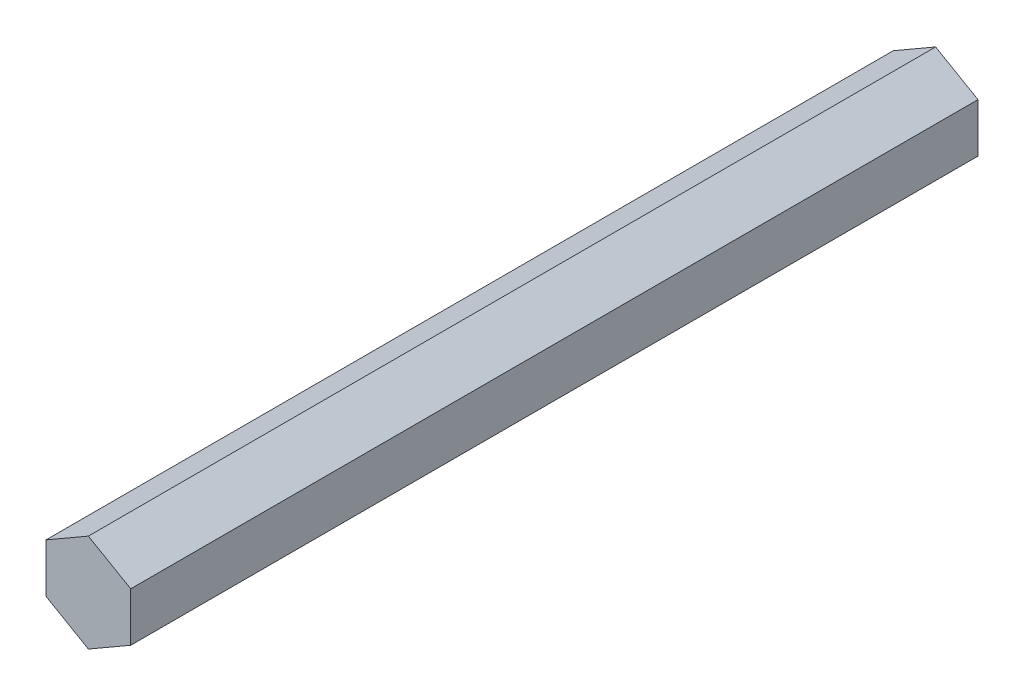
ISO-10303-21;
HEADER;
FILE_DESCRIPTION(('STEP AP214'),'2;1');
FILE_NAME('part.step','',(''),(''),'','','');
FILE_SCHEMA(('AUTOMOTIVE_DESIGN { 1 0 10303 214 1 1 1 1 }'));
ENDSEC;
DATA;
#1=APPLICATION_CONTEXT('core data for automotive mechanical design processes');
#2=APPLICATION_PROTOCOL_DEFINITION('international standard','automotive_design',2000,#1);
#3=PRODUCT_CONTEXT('',#1,'mechanical');
#4=PRODUCT('Part','Part','',(#3));
#5=PRODUCT_RELATED_PRODUCT_CATEGORY('part','',(#4));
#6=PRODUCT_DEFINITION_FORMATION('','',#4);
#7=PRODUCT_DEFINITION_CONTEXT('part definition',#1,'design');
#8=PRODUCT_DEFINITION('design','',#6,#7);
#9=PRODUCT_DEFINITION_SHAPE('','',#8);
#10=(LENGTH_UNIT() NAMED_UNIT(*) SI_UNIT(.MILLI.,.METRE.));
#11=(NAMED_UNIT(*) PLANE_ANGLE_UNIT() SI_UNIT($,.RADIAN.));
#12=(NAMED_UNIT(*) SI_UNIT($,.STERADIAN.) SOLID_ANGLE_UNIT());
#13=UNCERTAINTY_MEASURE_WITH_UNIT(LENGTH_MEASURE(1.E-05),#10,'distance_accuracy_value','');
#14=(GEOMETRIC_REPRESENTATION_CONTEXT(3) GLOBAL_UNCERTAINTY_ASSIGNED_CONTEXT((#13)) GLOBAL_UNIT_ASSIGNED_CONTEXT((#10,
#11,#12)) REPRESENTATION_CONTEXT('',''));
#15=CARTESIAN_POINT('',(0.,0.,0.));
#16=DIRECTION('',(0.,0.,1.));
#17=DIRECTION('',(1.,0.,0.));
#18=AXIS2_PLACEMENT_3D('',#15,#16,#17);
#19=CARTESIAN_POINT('',(0.,-7.33234841870825,127.));
#20=DIRECTION('',(-0.5,0.866025403784439,0.));
#21=DIRECTION('',(-0.866025403784439,-0.5,0.));
#22=AXIS2_PLACEMENT_3D('',#19,#20,#21);
#23=PLANE('',#22);
#24=DIRECTION('',(0.866025403784439,0.5,0.));
#25=VECTOR('',#24,1.);
#26=CARTESIAN_POINT('',(0.,-7.33234841870825,0.));
#27=LINE('',#26,#25);
#28=CARTESIAN_POINT('',(0.,-7.33234841870825,0.));
#29=VERTEX_POINT('',#28);
#30=CARTESIAN_POINT('',(6.35,-3.66617420935413,0.));
#31=VERTEX_POINT('',#30);
#32=EDGE_CURVE('E116',#29,#31,#27,.T.);
#33=ORIENTED_EDGE('',*,*,#32,.T.);
#34=DIRECTION('',(0.,0.,-1.));
#35=VECTOR('',#34,1.);
#36=CARTESIAN_POINT('',(6.35,-3.66617420935413,127.));
#37=LINE('',#36,#35);
#38=CARTESIAN_POINT('',(6.35,-3.66617420935413,127.));
#39=VERTEX_POINT('',#38);
#40=EDGE_CURVE('E11',#39,#31,#37,.T.);
#41=ORIENTED_EDGE('',*,*,#40,.F.);
#42=DIRECTION('',(0.866025403784439,0.5,0.));
#43=VECTOR('',#42,1.);
#44=CARTESIAN_POINT('',(0.,-7.33234841870825,127.));
#45=LINE('',#44,#43);
#46=CARTESIAN_POINT('',(0.,-7.33234841870825,127.));
#47=VERTEX_POINT('',#46);
#48=EDGE_CURVE('E126',#47,#39,#45,.T.);
#49=ORIENTED_EDGE('',*,*,#48,.F.);
#50=DIRECTION('',(0.,0.,-1.));
#51=VECTOR('',#50,1.);
#52=CARTESIAN_POINT('',(0.,-7.33234841870825,127.));
#53=LINE('',#52,#51);
#54=EDGE_CURVE('E112',#47,#29,#53,.T.);
#55=ORIENTED_EDGE('',*,*,#54,.T.);
#56=EDGE_LOOP('',(#33,#41,#49,#55));
#57=FACE_BOUND('',#56,.T.);
#58=ADVANCED_FACE('F32',(#57),#23,.F.);
#59=CARTESIAN_POINT('',(6.35,-3.66617420935413,127.));
#60=DIRECTION('',(-1.,0.,0.));
#61=DIRECTION('',(0.,0.,1.));
#62=AXIS2_PLACEMENT_3D('',#59,#60,#61);
#63=PLANE('',#62);
#64=DIRECTION('',(0.,1.,0.));
#65=VECTOR('',#64,1.);
#66=CARTESIAN_POINT('',(6.35,-3.66617420935413,0.));
#67=LINE('',#66,#65);
#68=CARTESIAN_POINT('',(6.35,3.66617420935412,0.));
#69=VERTEX_POINT('',#68);
#70=EDGE_CURVE('E119',#31,#69,#67,.T.);
#71=ORIENTED_EDGE('',*,*,#70,.T.);
#72=DIRECTION('',(0.,0.,-1.));
#73=VECTOR('',#72,1.);
#74=CARTESIAN_POINT('',(6.35,3.66617420935412,127.));
#75=LINE('',#74,#73);
#76=CARTESIAN_POINT('',(6.35,3.66617420935412,127.));
#77=VERTEX_POINT('',#76);
#78=EDGE_CURVE('E40',#77,#69,#75,.T.);
#79=ORIENTED_EDGE('',*,*,#78,.F.);
#80=DIRECTION('',(0.,1.,0.));
#81=VECTOR('',#80,1.);
#82=CARTESIAN_POINT('',(6.35,-3.66617420935413,127.));
#83=LINE('',#82,#81);
#84=EDGE_CURVE('E85',#39,#77,#83,.T.);
#85=ORIENTED_EDGE('',*,*,#84,.F.);
#86=ORIENTED_EDGE('',*,*,#40,.T.);
#87=EDGE_LOOP('',(#71,#79,#85,#86));
#88=FACE_BOUND('',#87,.T.);
#89=ADVANCED_FACE('F150',(#88),#63,.F.);
#90=CARTESIAN_POINT('',(6.35,3.66617420935412,127.));
#91=DIRECTION('',(-0.5,-0.866025403784438,0.));
#92=DIRECTION('',(0.866025403784439,-0.5,0.));
#93=AXIS2_PLACEMENT_3D('',#90,#91,#92);
#94=PLANE('',#93);
#95=DIRECTION('',(-0.866025403784438,0.5,0.));
#96=VECTOR('',#95,1.);
#97=CARTESIAN_POINT('',(6.35,3.66617420935412,0.));
#98=LINE('',#97,#96);
#99=CARTESIAN_POINT('',(0.,7.33234841870825,0.));
#100=VERTEX_POINT('',#99);
#101=EDGE_CURVE('E121',#69,#100,#98,.T.);
#102=ORIENTED_EDGE('',*,*,#101,.T.);
#103=DIRECTION('',(0.,0.,-1.));
#104=VECTOR('',#103,1.);
#105=CARTESIAN_POINT('',(0.,7.33234841870825,127.));
#106=LINE('',#105,#104);
#107=CARTESIAN_POINT('',(0.,7.33234841870825,127.));
#108=VERTEX_POINT('',#107);
#109=EDGE_CURVE('E107',#108,#100,#106,.T.);
#110=ORIENTED_EDGE('',*,*,#109,.F.);
#111=DIRECTION('',(-0.866025403784438,0.5,0.));
#112=VECTOR('',#111,1.);
#113=CARTESIAN_POINT('',(6.35,3.66617420935412,127.));
#114=LINE('',#113,#112);
#115=EDGE_CURVE('E98',#77,#108,#114,.T.);
#116=ORIENTED_EDGE('',*,*,#115,.F.);
#117=ORIENTED_EDGE('',*,*,#78,.T.);
#118=EDGE_LOOP('',(#102,#110,#116,#117));
#119=FACE_BOUND('',#118,.T.);
#120=ADVANCED_FACE('F132',(#119),#94,.F.);
#121=CARTESIAN_POINT('',(0.,7.33234841870825,127.));
#122=DIRECTION('',(0.499999999999999,-0.866025403784439,0.));
#123=DIRECTION('',(0.866025403784439,0.5,0.));
#124=AXIS2_PLACEMENT_3D('',#121,#122,#123);
#125=PLANE('',#124);
#126=DIRECTION('',(-0.866025403784439,-0.499999999999999,0.));
#127=VECTOR('',#126,1.);
#128=CARTESIAN_POINT('',(0.,7.33234841870825,0.));
#129=LINE('',#128,#127);
#130=CARTESIAN_POINT('',(-6.35,3.66617420935413,0.));
#131=VERTEX_POINT('',#130);
#132=EDGE_CURVE('E106',#100,#131,#129,.T.);
#133=ORIENTED_EDGE('',*,*,#132,.T.);
#134=DIRECTION('',(0.,0.,-1.));
#135=VECTOR('',#134,1.);
#136=CARTESIAN_POINT('',(-6.35,3.66617420935413,127.));
#137=LINE('',#136,#135);
#138=CARTESIAN_POINT('',(-6.35,3.66617420935413,127.));
#139=VERTEX_POINT('',#138);
#140=EDGE_CURVE('E103',#139,#131,#137,.T.);
#141=ORIENTED_EDGE('',*,*,#140,.F.);
#142=DIRECTION('',(-0.866025403784439,-0.499999999999999,0.));
#143=VECTOR('',#142,1.);
#144=CARTESIAN_POINT('',(0.,7.33234841870825,127.));
#145=LINE('',#144,#143);
#146=EDGE_CURVE('E92',#108,#139,#145,.T.);
#147=ORIENTED_EDGE('',*,*,#146,.F.);
#148=ORIENTED_EDGE('',*,*,#109,.T.);
#149=EDGE_LOOP('',(#133,#141,#147,#148));
#150=FACE_BOUND('',#149,.T.);
#151=ADVANCED_FACE('F104',(#150),#125,.F.);
#152=CARTESIAN_POINT('',(-6.35,3.66617420935413,127.));
#153=DIRECTION('',(1.,0.,0.));
#154=DIRECTION('',(0.,1.,0.));
#155=AXIS2_PLACEMENT_3D('',#152,#153,#154);
#156=PLANE('',#155);
#157=DIRECTION('',(0.,-1.,0.));
#158=VECTOR('',#157,1.);
#159=CARTESIAN_POINT('',(-6.35,3.66617420935413,0.));
#160=LINE('',#159,#158);
#161=CARTESIAN_POINT('',(-6.35,-3.66617420935412,0.));
#162=VERTEX_POINT('',#161);
#163=EDGE_CURVE('E71',#131,#162,#160,.T.);
#164=ORIENTED_EDGE('',*,*,#163,.T.);
#165=DIRECTION('',(0.,0.,-1.));
#166=VECTOR('',#165,1.);
#167=CARTESIAN_POINT('',(-6.35,-3.66617420935412,127.));
#168=LINE('',#167,#166);
#169=CARTESIAN_POINT('',(-6.35,-3.66617420935412,127.));
#170=VERTEX_POINT('',#169);
#171=EDGE_CURVE('E108',#170,#162,#168,.T.);
#172=ORIENTED_EDGE('',*,*,#171,.F.);
#173=DIRECTION('',(0.,-1.,0.));
#174=VECTOR('',#173,1.);
#175=CARTESIAN_POINT('',(-6.35,3.66617420935413,127.));
#176=LINE('',#175,#174);
#177=EDGE_CURVE('E96',#139,#170,#176,.T.);
#178=ORIENTED_EDGE('',*,*,#177,.F.);
#179=ORIENTED_EDGE('',*,*,#140,.T.);
#180=EDGE_LOOP('',(#164,#172,#178,#179));
#181=FACE_BOUND('',#180,.T.);
#182=ADVANCED_FACE('F110',(#181),#156,.F.);
#183=CARTESIAN_POINT('',(-6.35,-3.66617420935412,127.));
#184=DIRECTION('',(0.5,0.866025403784438,0.));
#185=DIRECTION('',(-0.866025403784439,0.5,0.));
#186=AXIS2_PLACEMENT_3D('',#183,#184,#185);
#187=PLANE('',#186);
#188=DIRECTION('',(0.866025403784439,-0.5,0.));
#189=VECTOR('',#188,1.);
#190=CARTESIAN_POINT('',(-6.35,-3.66617420935412,0.));
#191=LINE('',#190,#189);
#192=EDGE_CURVE('E77',#162,#29,#191,.T.);
#193=ORIENTED_EDGE('',*,*,#192,.T.);
#194=ORIENTED_EDGE('',*,*,#54,.F.);
#195=DIRECTION('',(0.866025403784439,-0.5,0.));
#196=VECTOR('',#195,1.);
#197=CARTESIAN_POINT('',(-6.35,-3.66617420935412,127.));
#198=LINE('',#197,#196);
#199=EDGE_CURVE('E48',#170,#47,#198,.T.);
#200=ORIENTED_EDGE('',*,*,#199,.F.);
#201=ORIENTED_EDGE('',*,*,#171,.T.);
#202=EDGE_LOOP('',(#193,#194,#200,#201));
#203=FACE_BOUND('',#202,.T.);
#204=ADVANCED_FACE('F139',(#203),#187,.F.);
#205=CARTESIAN_POINT('',(0.,0.,127.));
#206=DIRECTION('',(0.,0.,1.));
#207=DIRECTION('',(1.,0.,0.));
#208=AXIS2_PLACEMENT_3D('',#205,#206,#207);
#209=PLANE('',#208);
#210=ORIENTED_EDGE('',*,*,#48,.T.);
#211=ORIENTED_EDGE('',*,*,#84,.T.);
#212=ORIENTED_EDGE('',*,*,#115,.T.);
#213=ORIENTED_EDGE('',*,*,#146,.T.);
#214=ORIENTED_EDGE('',*,*,#177,.T.);
#215=ORIENTED_EDGE('',*,*,#199,.T.);
#216=EDGE_LOOP('',(#210,#211,#212,#213,#214,#215));
#217=FACE_BOUND('',#216,.T.);
#218=ADVANCED_FACE('F94',(#217),#209,.T.);
#219=CARTESIAN_POINT('',(0.,0.,0.));
#220=DIRECTION('',(0.,0.,1.));
#221=DIRECTION('',(1.,0.,0.));
#222=AXIS2_PLACEMENT_3D('',#219,#220,#221);
#223=PLANE('',#222);
#224=ORIENTED_EDGE('',*,*,#32,.F.);
#225=ORIENTED_EDGE('',*,*,#192,.F.);
#226=ORIENTED_EDGE('',*,*,#163,.F.);
#227=ORIENTED_EDGE('',*,*,#132,.F.);
#228=ORIENTED_EDGE('',*,*,#101,.F.);
#229=ORIENTED_EDGE('',*,*,#70,.F.);
#230=EDGE_LOOP('',(#224,#225,#226,#227,#228,#229));
#231=FACE_BOUND('',#230,.T.);
#232=ADVANCED_FACE('F135',(#231),#223,.F.);
#233=CLOSED_SHELL('',(#58,#89,#120,#151,#182,#204,#218,#232));
#234=MANIFOLD_SOLID_BREP('B2',#233);
#235=ADVANCED_BREP_SHAPE_REPRESENTATION('',(#18,#234),#14);
#236=SHAPE_DEFINITION_REPRESENTATION(#9,#235);
ENDSEC;
END-ISO-10303-21;
